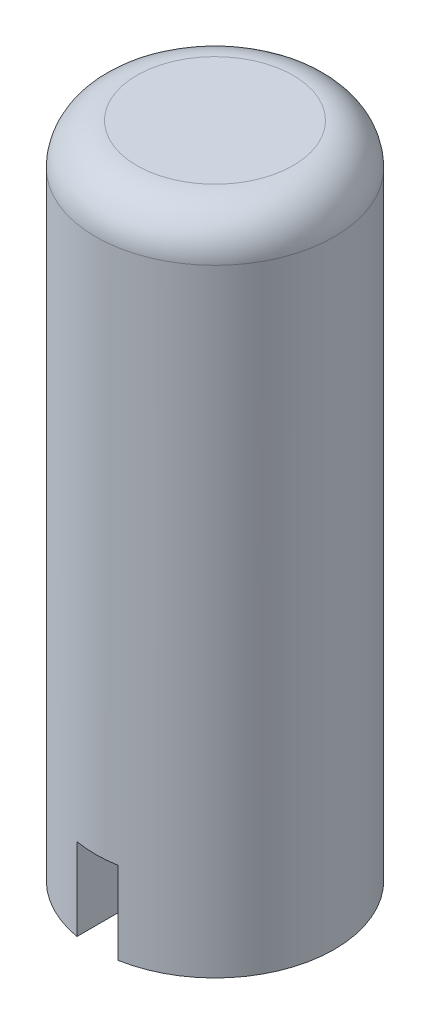
ISO-10303-21;
HEADER;
FILE_DESCRIPTION(('STEP AP214'),'2;1');
FILE_NAME('part.step','',(''),(''),'','','');
FILE_SCHEMA(('AUTOMOTIVE_DESIGN { 1 0 10303 214 1 1 1 1 }'));
ENDSEC;
DATA;
#1=APPLICATION_CONTEXT('core data for automotive mechanical design processes');
#2=APPLICATION_PROTOCOL_DEFINITION('international standard','automotive_design',2000,#1);
#3=PRODUCT_CONTEXT('',#1,'mechanical');
#4=PRODUCT('Part','Part','',(#3));
#5=PRODUCT_RELATED_PRODUCT_CATEGORY('part','',(#4));
#6=PRODUCT_DEFINITION_FORMATION('','',#4);
#7=PRODUCT_DEFINITION_CONTEXT('part definition',#1,'design');
#8=PRODUCT_DEFINITION('design','',#6,#7);
#9=PRODUCT_DEFINITION_SHAPE('','',#8);
#10=(LENGTH_UNIT() NAMED_UNIT(*) SI_UNIT(.MILLI.,.METRE.));
#11=(NAMED_UNIT(*) PLANE_ANGLE_UNIT() SI_UNIT($,.RADIAN.));
#12=(NAMED_UNIT(*) SI_UNIT($,.STERADIAN.) SOLID_ANGLE_UNIT());
#13=UNCERTAINTY_MEASURE_WITH_UNIT(LENGTH_MEASURE(1.E-05),#10,'distance_accuracy_value','');
#14=(GEOMETRIC_REPRESENTATION_CONTEXT(3) GLOBAL_UNCERTAINTY_ASSIGNED_CONTEXT((#13)) GLOBAL_UNIT_ASSIGNED_CONTEXT((#10,
#11,#12)) REPRESENTATION_CONTEXT('',''));
#15=CARTESIAN_POINT('',(0.,0.,0.));
#16=DIRECTION('',(0.,0.,1.));
#17=DIRECTION('',(1.,0.,0.));
#18=AXIS2_PLACEMENT_3D('',#15,#16,#17);
#19=CARTESIAN_POINT('',(0.,0.,0.));
#20=DIRECTION('',(0.,1.,0.));
#21=DIRECTION('',(0.,0.,1.));
#22=AXIS2_PLACEMENT_3D('',#19,#20,#21);
#23=PLANE('',#22);
#24=CARTESIAN_POINT('',(0.,0.,0.));
#25=DIRECTION('',(0.,1.,0.));
#26=DIRECTION('',(0.,0.,1.));
#27=AXIS2_PLACEMENT_3D('',#24,#25,#26);
#28=CIRCLE('',#27,2.9);
#29=CARTESIAN_POINT('',(0.499999999999998,0.,2.85657137141714));
#30=VERTEX_POINT('',#29);
#31=CARTESIAN_POINT('',(0.499999999999998,0.,-2.85657137141714));
#32=VERTEX_POINT('',#31);
#33=EDGE_CURVE('E136',#30,#32,#28,.T.);
#34=ORIENTED_EDGE('',*,*,#33,.F.);
#35=DIRECTION('',(0.,0.,1.));
#36=VECTOR('',#35,1.);
#37=CARTESIAN_POINT('',(0.499999999999998,0.,-3.05744859706141));
#38=LINE('',#37,#36);
#39=CARTESIAN_POINT('',(0.499999999999998,0.,1.3));
#40=VERTEX_POINT('',#39);
#41=EDGE_CURVE('E140',#40,#30,#38,.T.);
#42=ORIENTED_EDGE('',*,*,#41,.F.);
#43=DIRECTION('',(-1.,0.,0.));
#44=VECTOR('',#43,1.);
#45=CARTESIAN_POINT('',(-2.,0.,1.3));
#46=LINE('',#45,#44);
#47=CARTESIAN_POINT('',(0.6,0.,1.3));
#48=VERTEX_POINT('',#47);
#49=EDGE_CURVE('E179',#48,#40,#46,.T.);
#50=ORIENTED_EDGE('',*,*,#49,.F.);
#51=DIRECTION('',(0.,0.,1.));
#52=VECTOR('',#51,1.);
#53=CARTESIAN_POINT('',(0.6,0.,-1.3));
#54=LINE('',#53,#52);
#55=CARTESIAN_POINT('',(0.6,0.,-1.3));
#56=VERTEX_POINT('',#55);
#57=EDGE_CURVE('E180',#56,#48,#54,.T.);
#58=ORIENTED_EDGE('',*,*,#57,.F.);
#59=DIRECTION('',(1.,0.,0.));
#60=VECTOR('',#59,1.);
#61=CARTESIAN_POINT('',(-2.,0.,-1.3));
#62=LINE('',#61,#60);
#63=CARTESIAN_POINT('',(0.499999999999998,0.,-1.3));
#64=VERTEX_POINT('',#63);
#65=EDGE_CURVE('E138',#64,#56,#62,.T.);
#66=ORIENTED_EDGE('',*,*,#65,.F.);
#67=EDGE_CURVE('E124',#32,#64,#38,.T.);
#68=ORIENTED_EDGE('',*,*,#67,.F.);
#69=EDGE_LOOP('',(#34,#42,#50,#58,#66,#68));
#70=FACE_BOUND('',#69,.T.);
#71=ADVANCED_FACE('F33',(#70),#23,.F.);
#72=CARTESIAN_POINT('',(0.,16.,0.));
#73=DIRECTION('',(0.,-1.,0.));
#74=DIRECTION('',(0.,0.,-1.));
#75=AXIS2_PLACEMENT_3D('',#72,#73,#74);
#76=CYLINDRICAL_SURFACE('',#75,2.9);
#77=ORIENTED_EDGE('',*,*,#33,.T.);
#78=DIRECTION('',(0.,-1.,0.));
#79=VECTOR('',#78,1.);
#80=CARTESIAN_POINT('',(0.499999999999998,16.,-2.85657137141714));
#81=LINE('',#80,#79);
#82=CARTESIAN_POINT('',(0.499999999999998,2.,-2.85657137141714));
#83=VERTEX_POINT('',#82);
#84=EDGE_CURVE('E121',#32,#83,#81,.F.);
#85=ORIENTED_EDGE('',*,*,#84,.T.);
#86=CARTESIAN_POINT('',(0.,2.,0.));
#87=DIRECTION('',(0.,1.,0.));
#88=DIRECTION('',(0.,0.,1.));
#89=AXIS2_PLACEMENT_3D('',#86,#87,#88);
#90=CIRCLE('',#89,2.9);
#91=CARTESIAN_POINT('',(-0.500000000000002,2.,-2.85657137141714));
#92=VERTEX_POINT('',#91);
#93=EDGE_CURVE('E223',#83,#92,#90,.T.);
#94=ORIENTED_EDGE('',*,*,#93,.T.);
#95=DIRECTION('',(0.,-1.,0.));
#96=VECTOR('',#95,1.);
#97=CARTESIAN_POINT('',(-0.500000000000002,16.,-2.85657137141714));
#98=LINE('',#97,#96);
#99=CARTESIAN_POINT('',(-0.500000000000002,0.,-2.85657137141714));
#100=VERTEX_POINT('',#99);
#101=EDGE_CURVE('E214',#92,#100,#98,.T.);
#102=ORIENTED_EDGE('',*,*,#101,.T.);
#103=CARTESIAN_POINT('',(-0.500000000000002,0.,2.85657137141714));
#104=VERTEX_POINT('',#103);
#105=EDGE_CURVE('E147',#100,#104,#28,.T.);
#106=ORIENTED_EDGE('',*,*,#105,.T.);
#107=DIRECTION('',(0.,-1.,0.));
#108=VECTOR('',#107,1.);
#109=CARTESIAN_POINT('',(-0.500000000000002,16.,2.85657137141714));
#110=LINE('',#109,#108);
#111=CARTESIAN_POINT('',(-0.500000000000002,2.,2.85657137141714));
#112=VERTEX_POINT('',#111);
#113=EDGE_CURVE('E217',#104,#112,#110,.F.);
#114=ORIENTED_EDGE('',*,*,#113,.T.);
#115=CARTESIAN_POINT('',(0.499999999999998,2.,2.85657137141714));
#116=VERTEX_POINT('',#115);
#117=EDGE_CURVE('E224',#112,#116,#90,.T.);
#118=ORIENTED_EDGE('',*,*,#117,.T.);
#119=DIRECTION('',(0.,-1.,0.));
#120=VECTOR('',#119,1.);
#121=CARTESIAN_POINT('',(0.499999999999998,16.,2.85657137141714));
#122=LINE('',#121,#120);
#123=EDGE_CURVE('E129',#116,#30,#122,.T.);
#124=ORIENTED_EDGE('',*,*,#123,.T.);
#125=EDGE_LOOP('',(#77,#85,#94,#102,#106,#114,#118,#124));
#126=FACE_BOUND('',#125,.T.);
#127=CARTESIAN_POINT('',(0.,15.,0.));
#128=DIRECTION('',(0.,1.,0.));
#129=DIRECTION('',(0.,0.,1.));
#130=AXIS2_PLACEMENT_3D('',#127,#128,#129);
#131=CIRCLE('',#130,2.9);
#132=CARTESIAN_POINT('',(0.,15.,2.9));
#133=VERTEX_POINT('',#132);
#134=EDGE_CURVE('E150',#133,#133,#131,.F.);
#135=ORIENTED_EDGE('',*,*,#134,.T.);
#136=EDGE_LOOP('',(#135));
#137=FACE_BOUND('',#136,.T.);
#138=ADVANCED_FACE('F143',(#126,#137),#76,.T.);
#139=CARTESIAN_POINT('',(0.,16.,0.));
#140=DIRECTION('',(0.,1.,0.));
#141=DIRECTION('',(0.,0.,1.));
#142=AXIS2_PLACEMENT_3D('',#139,#140,#141);
#143=PLANE('',#142);
#144=CARTESIAN_POINT('',(0.,16.,0.));
#145=DIRECTION('',(0.,1.,0.));
#146=DIRECTION('',(0.,0.,1.));
#147=AXIS2_PLACEMENT_3D('',#144,#145,#146);
#148=CIRCLE('',#147,1.9);
#149=CARTESIAN_POINT('',(0.,16.,1.9));
#150=VERTEX_POINT('',#149);
#151=EDGE_CURVE('E146',#150,#150,#148,.T.);
#152=ORIENTED_EDGE('',*,*,#151,.T.);
#153=EDGE_LOOP('',(#152));
#154=FACE_BOUND('',#153,.T.);
#155=ADVANCED_FACE('F257',(#154),#143,.T.);
#156=ORIENTED_EDGE('',*,*,#105,.F.);
#157=DIRECTION('',(0.,0.,-1.));
#158=VECTOR('',#157,1.);
#159=CARTESIAN_POINT('',(-0.500000000000002,0.,-3.05744859706141));
#160=LINE('',#159,#158);
#161=CARTESIAN_POINT('',(-0.500000000000002,0.,-1.3));
#162=VERTEX_POINT('',#161);
#163=EDGE_CURVE('E139',#162,#100,#160,.T.);
#164=ORIENTED_EDGE('',*,*,#163,.F.);
#165=CARTESIAN_POINT('',(-2.,0.,-1.3));
#166=VERTEX_POINT('',#165);
#167=EDGE_CURVE('E186',#166,#162,#62,.T.);
#168=ORIENTED_EDGE('',*,*,#167,.F.);
#169=DIRECTION('',(0.,0.,-1.));
#170=VECTOR('',#169,1.);
#171=CARTESIAN_POINT('',(-2.,0.,-1.3));
#172=LINE('',#171,#170);
#173=CARTESIAN_POINT('',(-2.,0.,1.3));
#174=VERTEX_POINT('',#173);
#175=EDGE_CURVE('E178',#174,#166,#172,.T.);
#176=ORIENTED_EDGE('',*,*,#175,.F.);
#177=CARTESIAN_POINT('',(-0.500000000000002,0.,1.3));
#178=VERTEX_POINT('',#177);
#179=EDGE_CURVE('E167',#178,#174,#46,.T.);
#180=ORIENTED_EDGE('',*,*,#179,.F.);
#181=EDGE_CURVE('E175',#104,#178,#160,.T.);
#182=ORIENTED_EDGE('',*,*,#181,.F.);
#183=EDGE_LOOP('',(#156,#164,#168,#176,#180,#182));
#184=FACE_BOUND('',#183,.T.);
#185=ADVANCED_FACE('F174',(#184),#23,.F.);
#186=CARTESIAN_POINT('',(0.,15.,0.));
#187=DIRECTION('',(0.,1.,0.));
#188=DIRECTION('',(0.,0.,1.));
#189=AXIS2_PLACEMENT_3D('',#186,#187,#188);
#190=TOROIDAL_SURFACE('',#189,1.9,1.);
#191=ORIENTED_EDGE('',*,*,#134,.F.);
#192=EDGE_LOOP('',(#191));
#193=FACE_BOUND('',#192,.T.);
#194=ORIENTED_EDGE('',*,*,#151,.F.);
#195=EDGE_LOOP('',(#194));
#196=FACE_BOUND('',#195,.T.);
#197=ADVANCED_FACE('F35',(#193,#196),#190,.T.);
#198=CARTESIAN_POINT('',(0.6,2.6,-1.3));
#199=DIRECTION('',(1.,0.,0.));
#200=DIRECTION('',(0.,0.,-1.));
#201=AXIS2_PLACEMENT_3D('',#198,#199,#200);
#202=PLANE('',#201);
#203=ORIENTED_EDGE('',*,*,#57,.T.);
#204=DIRECTION('',(0.,-1.,0.));
#205=VECTOR('',#204,1.);
#206=CARTESIAN_POINT('',(0.6,2.6,1.3));
#207=LINE('',#206,#205);
#208=CARTESIAN_POINT('',(0.6,2.6,1.3));
#209=VERTEX_POINT('',#208);
#210=EDGE_CURVE('E155',#209,#48,#207,.T.);
#211=ORIENTED_EDGE('',*,*,#210,.F.);
#212=DIRECTION('',(0.,0.,1.));
#213=VECTOR('',#212,1.);
#214=CARTESIAN_POINT('',(0.6,2.6,-1.3));
#215=LINE('',#214,#213);
#216=CARTESIAN_POINT('',(0.6,2.6,-1.3));
#217=VERTEX_POINT('',#216);
#218=EDGE_CURVE('E189',#217,#209,#215,.T.);
#219=ORIENTED_EDGE('',*,*,#218,.F.);
#220=DIRECTION('',(0.,-1.,0.));
#221=VECTOR('',#220,1.);
#222=CARTESIAN_POINT('',(0.6,2.6,-1.3));
#223=LINE('',#222,#221);
#224=EDGE_CURVE('E153',#217,#56,#223,.T.);
#225=ORIENTED_EDGE('',*,*,#224,.T.);
#226=EDGE_LOOP('',(#203,#211,#219,#225));
#227=FACE_BOUND('',#226,.T.);
#228=ADVANCED_FACE('F250',(#227),#202,.F.);
#229=CARTESIAN_POINT('',(-2.,2.6,-1.3));
#230=DIRECTION('',(0.,0.,-1.));
#231=DIRECTION('',(-1.,0.,0.));
#232=AXIS2_PLACEMENT_3D('',#229,#230,#231);
#233=PLANE('',#232);
#234=DIRECTION('',(1.,0.,0.));
#235=VECTOR('',#234,1.);
#236=CARTESIAN_POINT('',(-2.,2.,-1.3));
#237=LINE('',#236,#235);
#238=CARTESIAN_POINT('',(-0.500000000000002,2.,-1.3));
#239=VERTEX_POINT('',#238);
#240=CARTESIAN_POINT('',(0.499999999999998,2.,-1.3));
#241=VERTEX_POINT('',#240);
#242=EDGE_CURVE('E226',#239,#241,#237,.T.);
#243=ORIENTED_EDGE('',*,*,#242,.T.);
#244=DIRECTION('',(0.,-1.,0.));
#245=VECTOR('',#244,1.);
#246=CARTESIAN_POINT('',(0.499999999999998,2.6,-1.3));
#247=LINE('',#246,#245);
#248=EDGE_CURVE('E130',#241,#64,#247,.T.);
#249=ORIENTED_EDGE('',*,*,#248,.T.);
#250=ORIENTED_EDGE('',*,*,#65,.T.);
#251=ORIENTED_EDGE('',*,*,#224,.F.);
#252=DIRECTION('',(1.,0.,0.));
#253=VECTOR('',#252,1.);
#254=CARTESIAN_POINT('',(-2.,2.6,-1.3));
#255=LINE('',#254,#253);
#256=CARTESIAN_POINT('',(-2.,2.6,-1.3));
#257=VERTEX_POINT('',#256);
#258=EDGE_CURVE('E197',#257,#217,#255,.T.);
#259=ORIENTED_EDGE('',*,*,#258,.F.);
#260=DIRECTION('',(0.,-1.,0.));
#261=VECTOR('',#260,1.);
#262=CARTESIAN_POINT('',(-2.,2.6,-1.3));
#263=LINE('',#262,#261);
#264=EDGE_CURVE('E192',#257,#166,#263,.T.);
#265=ORIENTED_EDGE('',*,*,#264,.T.);
#266=ORIENTED_EDGE('',*,*,#167,.T.);
#267=DIRECTION('',(0.,1.,0.));
#268=VECTOR('',#267,1.);
#269=CARTESIAN_POINT('',(-0.500000000000002,2.6,-1.3));
#270=LINE('',#269,#268);
#271=EDGE_CURVE('E220',#162,#239,#270,.T.);
#272=ORIENTED_EDGE('',*,*,#271,.T.);
#273=EDGE_LOOP('',(#243,#249,#250,#251,#259,#265,#266,#272));
#274=FACE_BOUND('',#273,.T.);
#275=ADVANCED_FACE('F240',(#274),#233,.F.);
#276=CARTESIAN_POINT('',(-2.,2.6,-1.3));
#277=DIRECTION('',(-1.,0.,0.));
#278=DIRECTION('',(0.,0.,1.));
#279=AXIS2_PLACEMENT_3D('',#276,#277,#278);
#280=PLANE('',#279);
#281=ORIENTED_EDGE('',*,*,#175,.T.);
#282=ORIENTED_EDGE('',*,*,#264,.F.);
#283=DIRECTION('',(0.,0.,-1.));
#284=VECTOR('',#283,1.);
#285=CARTESIAN_POINT('',(-2.,2.6,-1.3));
#286=LINE('',#285,#284);
#287=CARTESIAN_POINT('',(-2.,2.6,1.3));
#288=VERTEX_POINT('',#287);
#289=EDGE_CURVE('E201',#288,#257,#286,.T.);
#290=ORIENTED_EDGE('',*,*,#289,.F.);
#291=DIRECTION('',(0.,-1.,0.));
#292=VECTOR('',#291,1.);
#293=CARTESIAN_POINT('',(-2.,2.6,1.3));
#294=LINE('',#293,#292);
#295=EDGE_CURVE('E193',#288,#174,#294,.T.);
#296=ORIENTED_EDGE('',*,*,#295,.T.);
#297=EDGE_LOOP('',(#281,#282,#290,#296));
#298=FACE_BOUND('',#297,.T.);
#299=ADVANCED_FACE('F241',(#298),#280,.F.);
#300=CARTESIAN_POINT('',(-2.,2.6,1.3));
#301=DIRECTION('',(0.,0.,1.));
#302=DIRECTION('',(1.,0.,0.));
#303=AXIS2_PLACEMENT_3D('',#300,#301,#302);
#304=PLANE('',#303);
#305=ORIENTED_EDGE('',*,*,#49,.T.);
#306=DIRECTION('',(0.,1.,0.));
#307=VECTOR('',#306,1.);
#308=CARTESIAN_POINT('',(0.499999999999998,2.6,1.3));
#309=LINE('',#308,#307);
#310=CARTESIAN_POINT('',(0.499999999999998,2.,1.3));
#311=VERTEX_POINT('',#310);
#312=EDGE_CURVE('E11',#40,#311,#309,.T.);
#313=ORIENTED_EDGE('',*,*,#312,.T.);
#314=DIRECTION('',(-1.,0.,0.));
#315=VECTOR('',#314,1.);
#316=CARTESIAN_POINT('',(-2.,2.,1.3));
#317=LINE('',#316,#315);
#318=CARTESIAN_POINT('',(-0.500000000000002,2.,1.3));
#319=VERTEX_POINT('',#318);
#320=EDGE_CURVE('E160',#311,#319,#317,.T.);
#321=ORIENTED_EDGE('',*,*,#320,.T.);
#322=DIRECTION('',(0.,-1.,0.));
#323=VECTOR('',#322,1.);
#324=CARTESIAN_POINT('',(-0.500000000000002,2.6,1.3));
#325=LINE('',#324,#323);
#326=EDGE_CURVE('E41',#319,#178,#325,.T.);
#327=ORIENTED_EDGE('',*,*,#326,.T.);
#328=ORIENTED_EDGE('',*,*,#179,.T.);
#329=ORIENTED_EDGE('',*,*,#295,.F.);
#330=DIRECTION('',(-1.,0.,0.));
#331=VECTOR('',#330,1.);
#332=CARTESIAN_POINT('',(-2.,2.6,1.3));
#333=LINE('',#332,#331);
#334=EDGE_CURVE('E206',#209,#288,#333,.T.);
#335=ORIENTED_EDGE('',*,*,#334,.F.);
#336=ORIENTED_EDGE('',*,*,#210,.T.);
#337=EDGE_LOOP('',(#305,#313,#321,#327,#328,#329,#335,#336));
#338=FACE_BOUND('',#337,.T.);
#339=ADVANCED_FACE('F166',(#338),#304,.F.);
#340=CARTESIAN_POINT('',(0.,2.6,0.));
#341=DIRECTION('',(0.,1.,0.));
#342=DIRECTION('',(0.,0.,1.));
#343=AXIS2_PLACEMENT_3D('',#340,#341,#342);
#344=PLANE('',#343);
#345=ORIENTED_EDGE('',*,*,#218,.T.);
#346=ORIENTED_EDGE('',*,*,#334,.T.);
#347=ORIENTED_EDGE('',*,*,#289,.T.);
#348=ORIENTED_EDGE('',*,*,#258,.T.);
#349=EDGE_LOOP('',(#345,#346,#347,#348));
#350=FACE_BOUND('',#349,.T.);
#351=ADVANCED_FACE('F248',(#350),#344,.F.);
#352=CARTESIAN_POINT('',(0.,2.,0.));
#353=DIRECTION('',(0.,1.,0.));
#354=DIRECTION('',(0.,0.,1.));
#355=AXIS2_PLACEMENT_3D('',#352,#353,#354);
#356=PLANE('',#355);
#357=DIRECTION('',(0.,0.,-1.));
#358=VECTOR('',#357,1.);
#359=CARTESIAN_POINT('',(-0.500000000000002,2.,-3.05744859706141));
#360=LINE('',#359,#358);
#361=EDGE_CURVE('E56',#112,#319,#360,.T.);
#362=ORIENTED_EDGE('',*,*,#361,.T.);
#363=ORIENTED_EDGE('',*,*,#320,.F.);
#364=DIRECTION('',(0.,0.,1.));
#365=VECTOR('',#364,1.);
#366=CARTESIAN_POINT('',(0.499999999999998,2.,-3.05744859706141));
#367=LINE('',#366,#365);
#368=EDGE_CURVE('E233',#311,#116,#367,.T.);
#369=ORIENTED_EDGE('',*,*,#368,.T.);
#370=ORIENTED_EDGE('',*,*,#117,.F.);
#371=EDGE_LOOP('',(#362,#363,#369,#370));
#372=FACE_BOUND('',#371,.T.);
#373=ADVANCED_FACE('F283',(#372),#356,.F.);
#374=CARTESIAN_POINT('',(-0.500000000000002,2.,-3.05744859706141));
#375=DIRECTION('',(-1.,0.,0.));
#376=DIRECTION('',(0.,0.,1.));
#377=AXIS2_PLACEMENT_3D('',#374,#375,#376);
#378=PLANE('',#377);
#379=ORIENTED_EDGE('',*,*,#181,.T.);
#380=ORIENTED_EDGE('',*,*,#326,.F.);
#381=ORIENTED_EDGE('',*,*,#361,.F.);
#382=ORIENTED_EDGE('',*,*,#113,.F.);
#383=EDGE_LOOP('',(#379,#380,#381,#382));
#384=FACE_BOUND('',#383,.T.);
#385=ADVANCED_FACE('F236',(#384),#378,.F.);
#386=CARTESIAN_POINT('',(0.499999999999998,2.,-3.05744859706141));
#387=DIRECTION('',(1.,0.,0.));
#388=DIRECTION('',(0.,0.,-1.));
#389=AXIS2_PLACEMENT_3D('',#386,#387,#388);
#390=PLANE('',#389);
#391=ORIENTED_EDGE('',*,*,#368,.F.);
#392=ORIENTED_EDGE('',*,*,#312,.F.);
#393=ORIENTED_EDGE('',*,*,#41,.T.);
#394=ORIENTED_EDGE('',*,*,#123,.F.);
#395=EDGE_LOOP('',(#391,#392,#393,#394));
#396=FACE_BOUND('',#395,.T.);
#397=ADVANCED_FACE('F275',(#396),#390,.F.);
#398=ORIENTED_EDGE('',*,*,#67,.T.);
#399=ORIENTED_EDGE('',*,*,#248,.F.);
#400=EDGE_CURVE('E48',#83,#241,#367,.T.);
#401=ORIENTED_EDGE('',*,*,#400,.F.);
#402=ORIENTED_EDGE('',*,*,#84,.F.);
#403=EDGE_LOOP('',(#398,#399,#401,#402));
#404=FACE_BOUND('',#403,.T.);
#405=ADVANCED_FACE('F123',(#404),#390,.F.);
#406=EDGE_CURVE('E230',#239,#92,#360,.T.);
#407=ORIENTED_EDGE('',*,*,#406,.F.);
#408=ORIENTED_EDGE('',*,*,#271,.F.);
#409=ORIENTED_EDGE('',*,*,#163,.T.);
#410=ORIENTED_EDGE('',*,*,#101,.F.);
#411=EDGE_LOOP('',(#407,#408,#409,#410));
#412=FACE_BOUND('',#411,.T.);
#413=ADVANCED_FACE('F282',(#412),#378,.F.);
#414=ORIENTED_EDGE('',*,*,#400,.T.);
#415=ORIENTED_EDGE('',*,*,#242,.F.);
#416=ORIENTED_EDGE('',*,*,#406,.T.);
#417=ORIENTED_EDGE('',*,*,#93,.F.);
#418=EDGE_LOOP('',(#414,#415,#416,#417));
#419=FACE_BOUND('',#418,.T.);
#420=ADVANCED_FACE('F291',(#419),#356,.F.);
#421=CLOSED_SHELL('',(#71,#138,#155,#185,#197,#228,#275,#299,#339,#351,#373,#385,#397,#405,#413,#420));
#422=MANIFOLD_SOLID_BREP('B2',#421);
#423=ADVANCED_BREP_SHAPE_REPRESENTATION('',(#18,#422),#14);
#424=SHAPE_DEFINITION_REPRESENTATION(#9,#423);
ENDSEC;
END-ISO-10303-21;
